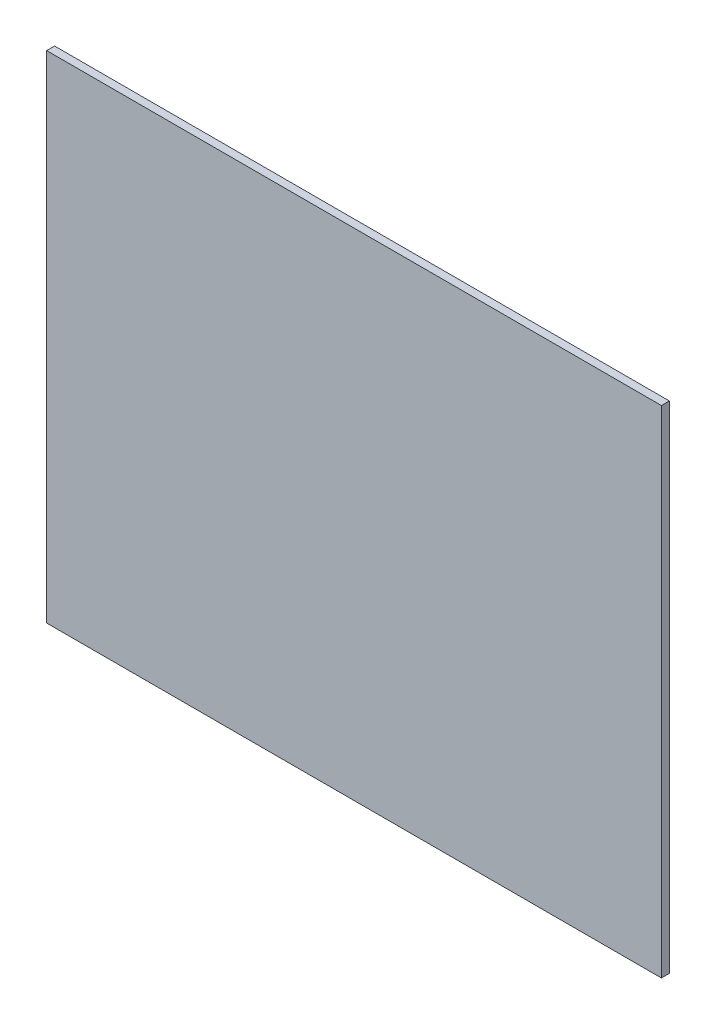
ISO-10303-21;
HEADER;
FILE_DESCRIPTION(('STEP AP214'),'2;1');
FILE_NAME('part.step','',(''),(''),'','','');
FILE_SCHEMA(('AUTOMOTIVE_DESIGN { 1 0 10303 214 1 1 1 1 }'));
ENDSEC;
DATA;
#1=APPLICATION_CONTEXT('core data for automotive mechanical design processes');
#2=APPLICATION_PROTOCOL_DEFINITION('international standard','automotive_design',2000,#1);
#3=PRODUCT_CONTEXT('',#1,'mechanical');
#4=PRODUCT('Part','Part','',(#3));
#5=PRODUCT_RELATED_PRODUCT_CATEGORY('part','',(#4));
#6=PRODUCT_DEFINITION_FORMATION('','',#4);
#7=PRODUCT_DEFINITION_CONTEXT('part definition',#1,'design');
#8=PRODUCT_DEFINITION('design','',#6,#7);
#9=PRODUCT_DEFINITION_SHAPE('','',#8);
#10=(LENGTH_UNIT() NAMED_UNIT(*) SI_UNIT(.MILLI.,.METRE.));
#11=(NAMED_UNIT(*) PLANE_ANGLE_UNIT() SI_UNIT($,.RADIAN.));
#12=(NAMED_UNIT(*) SI_UNIT($,.STERADIAN.) SOLID_ANGLE_UNIT());
#13=UNCERTAINTY_MEASURE_WITH_UNIT(LENGTH_MEASURE(1.E-05),#10,'distance_accuracy_value','');
#14=(GEOMETRIC_REPRESENTATION_CONTEXT(3) GLOBAL_UNCERTAINTY_ASSIGNED_CONTEXT((#13)) GLOBAL_UNIT_ASSIGNED_CONTEXT((#10,
#11,#12)) REPRESENTATION_CONTEXT('',''));
#15=CARTESIAN_POINT('',(0.,0.,0.));
#16=DIRECTION('',(0.,0.,1.));
#17=DIRECTION('',(1.,0.,0.));
#18=AXIS2_PLACEMENT_3D('',#15,#16,#17);
#19=CARTESIAN_POINT('',(77.5,-62.5,2.));
#20=DIRECTION('',(-1.,0.,0.));
#21=DIRECTION('',(0.,0.,1.));
#22=AXIS2_PLACEMENT_3D('',#19,#20,#21);
#23=PLANE('',#22);
#24=DIRECTION('',(0.,1.,0.));
#25=VECTOR('',#24,1.);
#26=CARTESIAN_POINT('',(77.5,-62.5,0.));
#27=LINE('',#26,#25);
#28=CARTESIAN_POINT('',(77.5,-62.5,0.));
#29=VERTEX_POINT('',#28);
#30=CARTESIAN_POINT('',(77.5,62.5,0.));
#31=VERTEX_POINT('',#30);
#32=EDGE_CURVE('E95',#29,#31,#27,.T.);
#33=ORIENTED_EDGE('',*,*,#32,.T.);
#34=DIRECTION('',(0.,0.,-1.));
#35=VECTOR('',#34,1.);
#36=CARTESIAN_POINT('',(77.5,62.5,2.));
#37=LINE('',#36,#35);
#38=CARTESIAN_POINT('',(77.5,62.5,2.));
#39=VERTEX_POINT('',#38);
#40=EDGE_CURVE('E11',#39,#31,#37,.T.);
#41=ORIENTED_EDGE('',*,*,#40,.F.);
#42=DIRECTION('',(0.,1.,0.));
#43=VECTOR('',#42,1.);
#44=CARTESIAN_POINT('',(77.5,-62.5,2.));
#45=LINE('',#44,#43);
#46=CARTESIAN_POINT('',(77.5,-62.5,2.));
#47=VERTEX_POINT('',#46);
#48=EDGE_CURVE('E83',#47,#39,#45,.T.);
#49=ORIENTED_EDGE('',*,*,#48,.F.);
#50=DIRECTION('',(0.,0.,-1.));
#51=VECTOR('',#50,1.);
#52=CARTESIAN_POINT('',(77.5,-62.5,2.));
#53=LINE('',#52,#51);
#54=EDGE_CURVE('E91',#47,#29,#53,.T.);
#55=ORIENTED_EDGE('',*,*,#54,.T.);
#56=EDGE_LOOP('',(#33,#41,#49,#55));
#57=FACE_BOUND('',#56,.T.);
#58=ADVANCED_FACE('F32',(#57),#23,.F.);
#59=CARTESIAN_POINT('',(-77.5,62.5,2.));
#60=DIRECTION('',(0.,-1.,0.));
#61=DIRECTION('',(0.,0.,-1.));
#62=AXIS2_PLACEMENT_3D('',#59,#60,#61);
#63=PLANE('',#62);
#64=DIRECTION('',(-1.,0.,0.));
#65=VECTOR('',#64,1.);
#66=CARTESIAN_POINT('',(-77.5,62.5,0.));
#67=LINE('',#66,#65);
#68=CARTESIAN_POINT('',(-77.5,62.5,0.));
#69=VERTEX_POINT('',#68);
#70=EDGE_CURVE('E87',#31,#69,#67,.T.);
#71=ORIENTED_EDGE('',*,*,#70,.T.);
#72=DIRECTION('',(0.,0.,-1.));
#73=VECTOR('',#72,1.);
#74=CARTESIAN_POINT('',(-77.5,62.5,2.));
#75=LINE('',#74,#73);
#76=CARTESIAN_POINT('',(-77.5,62.5,2.));
#77=VERTEX_POINT('',#76);
#78=EDGE_CURVE('E40',#77,#69,#75,.T.);
#79=ORIENTED_EDGE('',*,*,#78,.F.);
#80=DIRECTION('',(-1.,0.,0.));
#81=VECTOR('',#80,1.);
#82=CARTESIAN_POINT('',(-77.5,62.5,2.));
#83=LINE('',#82,#81);
#84=EDGE_CURVE('E78',#39,#77,#83,.T.);
#85=ORIENTED_EDGE('',*,*,#84,.F.);
#86=ORIENTED_EDGE('',*,*,#40,.T.);
#87=EDGE_LOOP('',(#71,#79,#85,#86));
#88=FACE_BOUND('',#87,.T.);
#89=ADVANCED_FACE('F86',(#88),#63,.F.);
#90=CARTESIAN_POINT('',(-77.5,-62.5,2.));
#91=DIRECTION('',(1.,0.,0.));
#92=DIRECTION('',(0.,0.,-1.));
#93=AXIS2_PLACEMENT_3D('',#90,#91,#92);
#94=PLANE('',#93);
#95=DIRECTION('',(0.,-1.,0.));
#96=VECTOR('',#95,1.);
#97=CARTESIAN_POINT('',(-77.5,-62.5,0.));
#98=LINE('',#97,#96);
#99=CARTESIAN_POINT('',(-77.5,-62.5,0.));
#100=VERTEX_POINT('',#99);
#101=EDGE_CURVE('E65',#69,#100,#98,.T.);
#102=ORIENTED_EDGE('',*,*,#101,.T.);
#103=DIRECTION('',(0.,0.,-1.));
#104=VECTOR('',#103,1.);
#105=CARTESIAN_POINT('',(-77.5,-62.5,2.));
#106=LINE('',#105,#104);
#107=CARTESIAN_POINT('',(-77.5,-62.5,2.));
#108=VERTEX_POINT('',#107);
#109=EDGE_CURVE('E88',#108,#100,#106,.T.);
#110=ORIENTED_EDGE('',*,*,#109,.F.);
#111=DIRECTION('',(0.,-1.,0.));
#112=VECTOR('',#111,1.);
#113=CARTESIAN_POINT('',(-77.5,-62.5,2.));
#114=LINE('',#113,#112);
#115=EDGE_CURVE('E81',#77,#108,#114,.T.);
#116=ORIENTED_EDGE('',*,*,#115,.F.);
#117=ORIENTED_EDGE('',*,*,#78,.T.);
#118=EDGE_LOOP('',(#102,#110,#116,#117));
#119=FACE_BOUND('',#118,.T.);
#120=ADVANCED_FACE('F89',(#119),#94,.F.);
#121=CARTESIAN_POINT('',(-77.5,-62.5,2.));
#122=DIRECTION('',(0.,1.,0.));
#123=DIRECTION('',(0.,0.,1.));
#124=AXIS2_PLACEMENT_3D('',#121,#122,#123);
#125=PLANE('',#124);
#126=DIRECTION('',(1.,0.,0.));
#127=VECTOR('',#126,1.);
#128=CARTESIAN_POINT('',(-77.5,-62.5,0.));
#129=LINE('',#128,#127);
#130=EDGE_CURVE('E71',#100,#29,#129,.T.);
#131=ORIENTED_EDGE('',*,*,#130,.T.);
#132=ORIENTED_EDGE('',*,*,#54,.F.);
#133=DIRECTION('',(1.,0.,0.));
#134=VECTOR('',#133,1.);
#135=CARTESIAN_POINT('',(-77.5,-62.5,2.));
#136=LINE('',#135,#134);
#137=EDGE_CURVE('E48',#108,#47,#136,.T.);
#138=ORIENTED_EDGE('',*,*,#137,.F.);
#139=ORIENTED_EDGE('',*,*,#109,.T.);
#140=EDGE_LOOP('',(#131,#132,#138,#139));
#141=FACE_BOUND('',#140,.T.);
#142=ADVANCED_FACE('F102',(#141),#125,.F.);
#143=CARTESIAN_POINT('',(0.,0.,2.));
#144=DIRECTION('',(0.,0.,-1.));
#145=DIRECTION('',(-1.,0.,0.));
#146=AXIS2_PLACEMENT_3D('',#143,#144,#145);
#147=PLANE('',#146);
#148=ORIENTED_EDGE('',*,*,#48,.T.);
#149=ORIENTED_EDGE('',*,*,#84,.T.);
#150=ORIENTED_EDGE('',*,*,#115,.T.);
#151=ORIENTED_EDGE('',*,*,#137,.T.);
#152=EDGE_LOOP('',(#148,#149,#150,#151));
#153=FACE_BOUND('',#152,.T.);
#154=ADVANCED_FACE('F79',(#153),#147,.F.);
#155=CARTESIAN_POINT('',(0.,0.,0.));
#156=DIRECTION('',(0.,0.,-1.));
#157=DIRECTION('',(-1.,0.,0.));
#158=AXIS2_PLACEMENT_3D('',#155,#156,#157);
#159=PLANE('',#158);
#160=ORIENTED_EDGE('',*,*,#32,.F.);
#161=ORIENTED_EDGE('',*,*,#130,.F.);
#162=ORIENTED_EDGE('',*,*,#101,.F.);
#163=ORIENTED_EDGE('',*,*,#70,.F.);
#164=EDGE_LOOP('',(#160,#161,#162,#163));
#165=FACE_BOUND('',#164,.T.);
#166=ADVANCED_FACE('F105',(#165),#159,.T.);
#167=CLOSED_SHELL('',(#58,#89,#120,#142,#154,#166));
#168=MANIFOLD_SOLID_BREP('B2',#167);
#169=ADVANCED_BREP_SHAPE_REPRESENTATION('',(#18,#168),#14);
#170=SHAPE_DEFINITION_REPRESENTATION(#9,#169);
ENDSEC;
END-ISO-10303-21;
